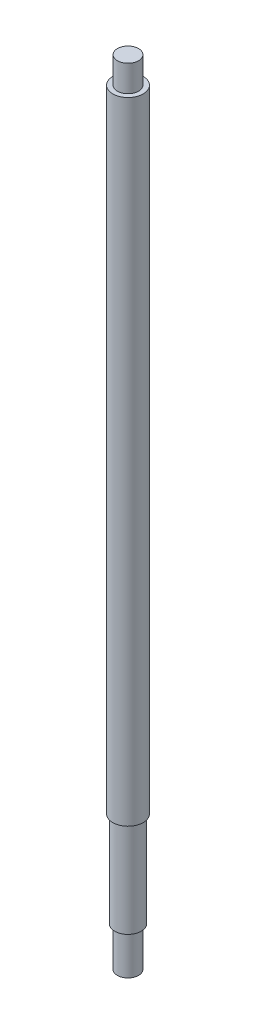
ISO-10303-21;
HEADER;
FILE_DESCRIPTION(('STEP AP214'),'2;1');
FILE_NAME('part.step','',(''),(''),'','','');
FILE_SCHEMA(('AUTOMOTIVE_DESIGN { 1 0 10303 214 1 1 1 1 }'));
ENDSEC;
DATA;
#1=APPLICATION_CONTEXT('core data for automotive mechanical design processes');
#2=APPLICATION_PROTOCOL_DEFINITION('international standard','automotive_design',2000,#1);
#3=PRODUCT_CONTEXT('',#1,'mechanical');
#4=PRODUCT('Part','Part','',(#3));
#5=PRODUCT_RELATED_PRODUCT_CATEGORY('part','',(#4));
#6=PRODUCT_DEFINITION_FORMATION('','',#4);
#7=PRODUCT_DEFINITION_CONTEXT('part definition',#1,'design');
#8=PRODUCT_DEFINITION('design','',#6,#7);
#9=PRODUCT_DEFINITION_SHAPE('','',#8);
#10=(LENGTH_UNIT() NAMED_UNIT(*) SI_UNIT(.MILLI.,.METRE.));
#11=(NAMED_UNIT(*) PLANE_ANGLE_UNIT() SI_UNIT($,.RADIAN.));
#12=(NAMED_UNIT(*) SI_UNIT($,.STERADIAN.) SOLID_ANGLE_UNIT());
#13=UNCERTAINTY_MEASURE_WITH_UNIT(LENGTH_MEASURE(1.E-05),#10,'distance_accuracy_value','');
#14=(GEOMETRIC_REPRESENTATION_CONTEXT(3) GLOBAL_UNCERTAINTY_ASSIGNED_CONTEXT((#13)) GLOBAL_UNIT_ASSIGNED_CONTEXT((#10,
#11,#12)) REPRESENTATION_CONTEXT('',''));
#15=CARTESIAN_POINT('',(0.,0.,0.));
#16=DIRECTION('',(0.,0.,1.));
#17=DIRECTION('',(1.,0.,0.));
#18=AXIS2_PLACEMENT_3D('',#15,#16,#17);
#19=CARTESIAN_POINT('',(0.,0.,0.));
#20=DIRECTION('',(0.,-1.,0.));
#21=DIRECTION('',(0.,0.,-1.));
#22=AXIS2_PLACEMENT_3D('',#19,#20,#21);
#23=PLANE('',#22);
#24=CARTESIAN_POINT('',(0.,0.,0.));
#25=DIRECTION('',(0.,1.,0.));
#26=DIRECTION('',(0.,0.,1.));
#27=AXIS2_PLACEMENT_3D('',#24,#25,#26);
#28=CIRCLE('',#27,4.);
#29=CARTESIAN_POINT('',(0.,0.,4.));
#30=VERTEX_POINT('',#29);
#31=EDGE_CURVE('E12',#30,#30,#28,.T.);
#32=ORIENTED_EDGE('',*,*,#31,.T.);
#33=EDGE_LOOP('',(#32));
#34=FACE_BOUND('',#33,.T.);
#35=ADVANCED_FACE('F48',(#34),#23,.F.);
#36=CARTESIAN_POINT('',(0.,24.014554369243,0.));
#37=DIRECTION('',(0.,1.,0.));
#38=DIRECTION('',(0.,0.,1.));
#39=AXIS2_PLACEMENT_3D('',#36,#37,#38);
#40=CYLINDRICAL_SURFACE('',#39,4.);
#41=ORIENTED_EDGE('',*,*,#31,.F.);
#42=EDGE_LOOP('',(#41));
#43=FACE_BOUND('',#42,.T.);
#44=CARTESIAN_POINT('',(0.,-10.,0.));
#45=DIRECTION('',(0.,1.,0.));
#46=DIRECTION('',(0.,0.,1.));
#47=AXIS2_PLACEMENT_3D('',#44,#45,#46);
#48=CIRCLE('',#47,4.);
#49=CARTESIAN_POINT('',(0.,-10.,4.));
#50=VERTEX_POINT('',#49);
#51=EDGE_CURVE('E55',#50,#50,#48,.T.);
#52=ORIENTED_EDGE('',*,*,#51,.T.);
#53=EDGE_LOOP('',(#52));
#54=FACE_BOUND('',#53,.T.);
#55=ADVANCED_FACE('F103',(#43,#54),#40,.T.);
#56=CARTESIAN_POINT('',(4.00000000000005,-10.,1.94289029309402E-13));
#57=DIRECTION('',(0.,-1.,0.));
#58=DIRECTION('',(0.,0.,-1.));
#59=AXIS2_PLACEMENT_3D('',#56,#57,#58);
#60=PLANE('',#59);
#61=ORIENTED_EDGE('',*,*,#51,.F.);
#62=EDGE_LOOP('',(#61));
#63=FACE_BOUND('',#62,.T.);
#64=CARTESIAN_POINT('',(0.,-10.,0.));
#65=DIRECTION('',(0.,1.,0.));
#66=DIRECTION('',(0.,0.,1.));
#67=AXIS2_PLACEMENT_3D('',#64,#65,#66);
#68=CIRCLE('',#67,5.75);
#69=CARTESIAN_POINT('',(0.,-10.,5.75));
#70=VERTEX_POINT('',#69);
#71=EDGE_CURVE('E61',#70,#70,#68,.T.);
#72=ORIENTED_EDGE('',*,*,#71,.T.);
#73=EDGE_LOOP('',(#72));
#74=FACE_BOUND('',#73,.T.);
#75=ADVANCED_FACE('F107',(#63,#74),#60,.F.);
#76=CARTESIAN_POINT('',(0.,24.014554369243,0.));
#77=DIRECTION('',(0.,1.,0.));
#78=DIRECTION('',(0.,0.,1.));
#79=AXIS2_PLACEMENT_3D('',#76,#77,#78);
#80=CYLINDRICAL_SURFACE('',#79,5.75000000000002);
#81=ORIENTED_EDGE('',*,*,#71,.F.);
#82=EDGE_LOOP('',(#81));
#83=FACE_BOUND('',#82,.T.);
#84=CARTESIAN_POINT('',(0.,-249.,0.));
#85=DIRECTION('',(0.,1.,0.));
#86=DIRECTION('',(0.,0.,1.));
#87=AXIS2_PLACEMENT_3D('',#84,#85,#86);
#88=CIRCLE('',#87,5.75000000000003);
#89=CARTESIAN_POINT('',(0.,-249.,5.75000000000003));
#90=VERTEX_POINT('',#89);
#91=EDGE_CURVE('E67',#90,#90,#88,.T.);
#92=ORIENTED_EDGE('',*,*,#91,.T.);
#93=EDGE_LOOP('',(#92));
#94=FACE_BOUND('',#93,.T.);
#95=ADVANCED_FACE('F112',(#83,#94),#80,.T.);
#96=CARTESIAN_POINT('',(5.75000000000012,-249.,1.66533453693773E-13));
#97=DIRECTION('',(0.,1.,0.));
#98=DIRECTION('',(0.,0.,1.));
#99=AXIS2_PLACEMENT_3D('',#96,#97,#98);
#100=PLANE('',#99);
#101=ORIENTED_EDGE('',*,*,#91,.F.);
#102=EDGE_LOOP('',(#101));
#103=FACE_BOUND('',#102,.T.);
#104=CARTESIAN_POINT('',(0.,-249.,0.));
#105=DIRECTION('',(0.,1.,0.));
#106=DIRECTION('',(0.,0.,1.));
#107=AXIS2_PLACEMENT_3D('',#104,#105,#106);
#108=CIRCLE('',#107,5.00000000000003);
#109=CARTESIAN_POINT('',(0.,-249.,5.00000000000003));
#110=VERTEX_POINT('',#109);
#111=EDGE_CURVE('E73',#110,#110,#108,.T.);
#112=ORIENTED_EDGE('',*,*,#111,.T.);
#113=EDGE_LOOP('',(#112));
#114=FACE_BOUND('',#113,.T.);
#115=ADVANCED_FACE('F118',(#103,#114),#100,.F.);
#116=CARTESIAN_POINT('',(0.,24.014554369243,0.));
#117=DIRECTION('',(0.,1.,0.));
#118=DIRECTION('',(0.,0.,1.));
#119=AXIS2_PLACEMENT_3D('',#116,#117,#118);
#120=CYLINDRICAL_SURFACE('',#119,5.00000000000004);
#121=ORIENTED_EDGE('',*,*,#111,.F.);
#122=EDGE_LOOP('',(#121));
#123=FACE_BOUND('',#122,.T.);
#124=CARTESIAN_POINT('',(0.,-285.,0.));
#125=DIRECTION('',(0.,1.,0.));
#126=DIRECTION('',(0.,0.,1.));
#127=AXIS2_PLACEMENT_3D('',#124,#125,#126);
#128=CIRCLE('',#127,5.00000000000004);
#129=CARTESIAN_POINT('',(0.,-285.,5.00000000000004));
#130=VERTEX_POINT('',#129);
#131=EDGE_CURVE('E77',#130,#130,#128,.T.);
#132=ORIENTED_EDGE('',*,*,#131,.T.);
#133=EDGE_LOOP('',(#132));
#134=FACE_BOUND('',#133,.T.);
#135=ADVANCED_FACE('F122',(#123,#134),#120,.T.);
#136=CARTESIAN_POINT('',(5.00000000000006,-285.,0.));
#137=DIRECTION('',(0.,1.,0.));
#138=DIRECTION('',(0.,0.,1.));
#139=AXIS2_PLACEMENT_3D('',#136,#137,#138);
#140=PLANE('',#139);
#141=ORIENTED_EDGE('',*,*,#131,.F.);
#142=EDGE_LOOP('',(#141));
#143=FACE_BOUND('',#142,.T.);
#144=CARTESIAN_POINT('',(0.,-285.,0.));
#145=DIRECTION('',(0.,1.,0.));
#146=DIRECTION('',(0.,0.,1.));
#147=AXIS2_PLACEMENT_3D('',#144,#145,#146);
#148=CIRCLE('',#147,4.00000000000004);
#149=CARTESIAN_POINT('',(0.,-285.,4.00000000000004));
#150=VERTEX_POINT('',#149);
#151=EDGE_CURVE('E81',#150,#150,#148,.T.);
#152=ORIENTED_EDGE('',*,*,#151,.T.);
#153=EDGE_LOOP('',(#152));
#154=FACE_BOUND('',#153,.T.);
#155=ADVANCED_FACE('F99',(#143,#154),#140,.F.);
#156=CARTESIAN_POINT('',(0.,24.014554369243,0.));
#157=DIRECTION('',(0.,1.,0.));
#158=DIRECTION('',(0.,0.,1.));
#159=AXIS2_PLACEMENT_3D('',#156,#157,#158);
#160=CYLINDRICAL_SURFACE('',#159,4.00000000000004);
#161=ORIENTED_EDGE('',*,*,#151,.F.);
#162=EDGE_LOOP('',(#161));
#163=FACE_BOUND('',#162,.T.);
#164=CARTESIAN_POINT('',(0.,-300.,0.));
#165=DIRECTION('',(0.,1.,0.));
#166=DIRECTION('',(0.,0.,1.));
#167=AXIS2_PLACEMENT_3D('',#164,#165,#166);
#168=CIRCLE('',#167,4.00000000000004);
#169=CARTESIAN_POINT('',(0.,-300.,4.00000000000004));
#170=VERTEX_POINT('',#169);
#171=EDGE_CURVE('E85',#170,#170,#168,.T.);
#172=ORIENTED_EDGE('',*,*,#171,.T.);
#173=EDGE_LOOP('',(#172));
#174=FACE_BOUND('',#173,.T.);
#175=ADVANCED_FACE('F91',(#163,#174),#160,.T.);
#176=CARTESIAN_POINT('',(4.00000000000006,-300.,0.));
#177=DIRECTION('',(0.,1.,0.));
#178=DIRECTION('',(0.,0.,1.));
#179=AXIS2_PLACEMENT_3D('',#176,#177,#178);
#180=PLANE('',#179);
#181=ORIENTED_EDGE('',*,*,#171,.F.);
#182=EDGE_LOOP('',(#181));
#183=FACE_BOUND('',#182,.T.);
#184=ADVANCED_FACE('F93',(#183),#180,.F.);
#185=CLOSED_SHELL('',(#35,#55,#75,#95,#115,#135,#155,#175,#184));
#186=MANIFOLD_SOLID_BREP('B2',#185);
#187=ADVANCED_BREP_SHAPE_REPRESENTATION('',(#18,#186),#14);
#188=SHAPE_DEFINITION_REPRESENTATION(#9,#187);
ENDSEC;
END-ISO-10303-21;
